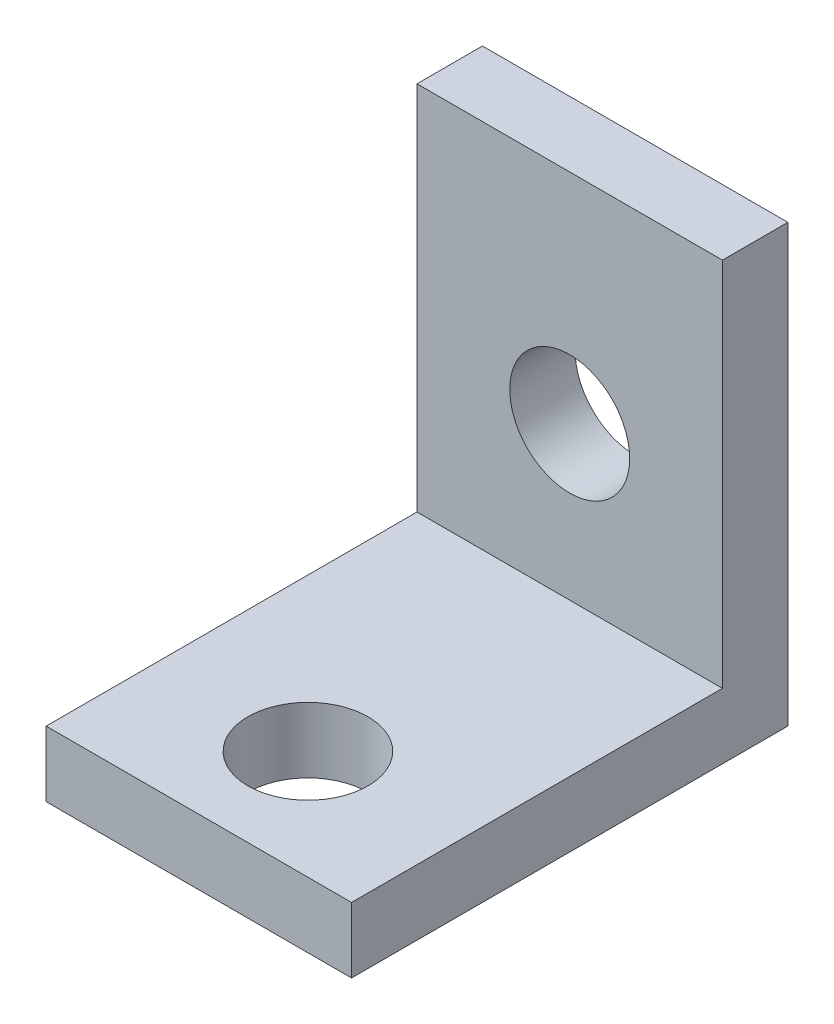
ISO-10303-21;
HEADER;
FILE_DESCRIPTION(('STEP AP214'),'2;1');
FILE_NAME('part.step','',(''),(''),'','','');
FILE_SCHEMA(('AUTOMOTIVE_DESIGN { 1 0 10303 214 1 1 1 1 }'));
ENDSEC;
DATA;
#1=APPLICATION_CONTEXT('core data for automotive mechanical design processes');
#2=APPLICATION_PROTOCOL_DEFINITION('international standard','automotive_design',2000,#1);
#3=PRODUCT_CONTEXT('',#1,'mechanical');
#4=PRODUCT('Part','Part','',(#3));
#5=PRODUCT_RELATED_PRODUCT_CATEGORY('part','',(#4));
#6=PRODUCT_DEFINITION_FORMATION('','',#4);
#7=PRODUCT_DEFINITION_CONTEXT('part definition',#1,'design');
#8=PRODUCT_DEFINITION('design','',#6,#7);
#9=PRODUCT_DEFINITION_SHAPE('','',#8);
#10=(LENGTH_UNIT() NAMED_UNIT(*) SI_UNIT(.MILLI.,.METRE.));
#11=(NAMED_UNIT(*) PLANE_ANGLE_UNIT() SI_UNIT($,.RADIAN.));
#12=(NAMED_UNIT(*) SI_UNIT($,.STERADIAN.) SOLID_ANGLE_UNIT());
#13=UNCERTAINTY_MEASURE_WITH_UNIT(LENGTH_MEASURE(1.E-05),#10,'distance_accuracy_value','');
#14=(GEOMETRIC_REPRESENTATION_CONTEXT(3) GLOBAL_UNCERTAINTY_ASSIGNED_CONTEXT((#13)) GLOBAL_UNIT_ASSIGNED_CONTEXT((#10,
#11,#12)) REPRESENTATION_CONTEXT('',''));
#15=CARTESIAN_POINT('',(0.,0.,0.));
#16=DIRECTION('',(0.,0.,1.));
#17=DIRECTION('',(1.,0.,0.));
#18=AXIS2_PLACEMENT_3D('',#15,#16,#17);
#19=CARTESIAN_POINT('',(7.,0.,20.));
#20=DIRECTION('',(0.,1.,0.));
#21=DIRECTION('',(0.,0.,1.));
#22=AXIS2_PLACEMENT_3D('',#19,#20,#21);
#23=PLANE('',#22);
#24=DIRECTION('',(-1.,0.,0.));
#25=VECTOR('',#24,1.);
#26=CARTESIAN_POINT('',(7.,0.,20.));
#27=LINE('',#26,#25);
#28=CARTESIAN_POINT('',(7.,0.,20.));
#29=VERTEX_POINT('',#28);
#30=CARTESIAN_POINT('',(-7.,0.,20.));
#31=VERTEX_POINT('',#30);
#32=EDGE_CURVE('E11',#29,#31,#27,.T.);
#33=ORIENTED_EDGE('',*,*,#32,.T.);
#34=DIRECTION('',(0.,0.,-1.));
#35=VECTOR('',#34,1.);
#36=CARTESIAN_POINT('',(-7.,0.,20.));
#37=LINE('',#36,#35);
#38=CARTESIAN_POINT('',(-7.,0.,0.));
#39=VERTEX_POINT('',#38);
#40=EDGE_CURVE('E88',#31,#39,#37,.T.);
#41=ORIENTED_EDGE('',*,*,#40,.T.);
#42=DIRECTION('',(-1.,0.,0.));
#43=VECTOR('',#42,1.);
#44=CARTESIAN_POINT('',(7.,0.,0.));
#45=LINE('',#44,#43);
#46=CARTESIAN_POINT('',(7.,0.,0.));
#47=VERTEX_POINT('',#46);
#48=EDGE_CURVE('E41',#47,#39,#45,.T.);
#49=ORIENTED_EDGE('',*,*,#48,.F.);
#50=DIRECTION('',(0.,0.,-1.));
#51=VECTOR('',#50,1.);
#52=CARTESIAN_POINT('',(7.,0.,20.));
#53=LINE('',#52,#51);
#54=EDGE_CURVE('E89',#29,#47,#53,.T.);
#55=ORIENTED_EDGE('',*,*,#54,.F.);
#56=EDGE_LOOP('',(#33,#41,#49,#55));
#57=FACE_BOUND('',#56,.T.);
#58=CARTESIAN_POINT('',(0.,0.,15.));
#59=DIRECTION('',(0.,1.,0.));
#60=DIRECTION('',(0.,0.,1.));
#61=AXIS2_PLACEMENT_3D('',#58,#59,#60);
#62=CIRCLE('',#61,2.75);
#63=CARTESIAN_POINT('',(0.,0.,17.75));
#64=VERTEX_POINT('',#63);
#65=EDGE_CURVE('E159',#64,#64,#62,.T.);
#66=ORIENTED_EDGE('',*,*,#65,.T.);
#67=EDGE_LOOP('',(#66));
#68=FACE_BOUND('',#67,.T.);
#69=ADVANCED_FACE('F33',(#57,#68),#23,.F.);
#70=CARTESIAN_POINT('',(7.,3.,3.));
#71=DIRECTION('',(0.,-1.,0.));
#72=DIRECTION('',(0.,0.,-1.));
#73=AXIS2_PLACEMENT_3D('',#70,#71,#72);
#74=PLANE('',#73);
#75=DIRECTION('',(-1.,0.,0.));
#76=VECTOR('',#75,1.);
#77=CARTESIAN_POINT('',(7.,3.,3.));
#78=LINE('',#77,#76);
#79=CARTESIAN_POINT('',(7.,3.,3.));
#80=VERTEX_POINT('',#79);
#81=CARTESIAN_POINT('',(-7.,3.,3.));
#82=VERTEX_POINT('',#81);
#83=EDGE_CURVE('E131',#80,#82,#78,.T.);
#84=ORIENTED_EDGE('',*,*,#83,.T.);
#85=DIRECTION('',(0.,0.,1.));
#86=VECTOR('',#85,1.);
#87=CARTESIAN_POINT('',(-7.,3.,3.));
#88=LINE('',#87,#86);
#89=CARTESIAN_POINT('',(-7.,3.,20.));
#90=VERTEX_POINT('',#89);
#91=EDGE_CURVE('E119',#82,#90,#88,.T.);
#92=ORIENTED_EDGE('',*,*,#91,.T.);
#93=DIRECTION('',(-1.,0.,0.));
#94=VECTOR('',#93,1.);
#95=CARTESIAN_POINT('',(7.,3.,20.));
#96=LINE('',#95,#94);
#97=CARTESIAN_POINT('',(7.,3.,20.));
#98=VERTEX_POINT('',#97);
#99=EDGE_CURVE('E104',#98,#90,#96,.T.);
#100=ORIENTED_EDGE('',*,*,#99,.F.);
#101=DIRECTION('',(0.,0.,1.));
#102=VECTOR('',#101,1.);
#103=CARTESIAN_POINT('',(7.,3.,3.));
#104=LINE('',#103,#102);
#105=EDGE_CURVE('E48',#80,#98,#104,.T.);
#106=ORIENTED_EDGE('',*,*,#105,.F.);
#107=EDGE_LOOP('',(#84,#92,#100,#106));
#108=FACE_BOUND('',#107,.T.);
#109=CARTESIAN_POINT('',(0.,3.,15.));
#110=DIRECTION('',(0.,1.,0.));
#111=DIRECTION('',(0.,0.,1.));
#112=AXIS2_PLACEMENT_3D('',#109,#110,#111);
#113=CIRCLE('',#112,2.75);
#114=CARTESIAN_POINT('',(0.,3.,17.75));
#115=VERTEX_POINT('',#114);
#116=EDGE_CURVE('E157',#115,#115,#113,.T.);
#117=ORIENTED_EDGE('',*,*,#116,.F.);
#118=EDGE_LOOP('',(#117));
#119=FACE_BOUND('',#118,.T.);
#120=ADVANCED_FACE('F151',(#108,#119),#74,.F.);
#121=CARTESIAN_POINT('',(7.,0.,0.));
#122=DIRECTION('',(0.,0.,1.));
#123=DIRECTION('',(1.,0.,0.));
#124=AXIS2_PLACEMENT_3D('',#121,#122,#123);
#125=PLANE('',#124);
#126=ORIENTED_EDGE('',*,*,#48,.T.);
#127=DIRECTION('',(0.,1.,0.));
#128=VECTOR('',#127,1.);
#129=CARTESIAN_POINT('',(-7.,0.,0.));
#130=LINE('',#129,#128);
#131=CARTESIAN_POINT('',(-7.,20.,0.));
#132=VERTEX_POINT('',#131);
#133=EDGE_CURVE('E102',#39,#132,#130,.T.);
#134=ORIENTED_EDGE('',*,*,#133,.T.);
#135=DIRECTION('',(-1.,0.,0.));
#136=VECTOR('',#135,1.);
#137=CARTESIAN_POINT('',(7.,20.,0.));
#138=LINE('',#137,#136);
#139=CARTESIAN_POINT('',(7.,20.,0.));
#140=VERTEX_POINT('',#139);
#141=EDGE_CURVE('E135',#140,#132,#138,.T.);
#142=ORIENTED_EDGE('',*,*,#141,.F.);
#143=DIRECTION('',(0.,1.,0.));
#144=VECTOR('',#143,1.);
#145=CARTESIAN_POINT('',(7.,0.,0.));
#146=LINE('',#145,#144);
#147=EDGE_CURVE('E124',#47,#140,#146,.T.);
#148=ORIENTED_EDGE('',*,*,#147,.F.);
#149=EDGE_LOOP('',(#126,#134,#142,#148));
#150=FACE_BOUND('',#149,.T.);
#151=CARTESIAN_POINT('',(0.,10.,0.));
#152=DIRECTION('',(0.,0.,1.));
#153=DIRECTION('',(1.,0.,0.));
#154=AXIS2_PLACEMENT_3D('',#151,#152,#153);
#155=CIRCLE('',#154,2.75);
#156=CARTESIAN_POINT('',(2.75,10.,0.));
#157=VERTEX_POINT('',#156);
#158=EDGE_CURVE('E108',#157,#157,#155,.T.);
#159=ORIENTED_EDGE('',*,*,#158,.T.);
#160=EDGE_LOOP('',(#159));
#161=FACE_BOUND('',#160,.T.);
#162=ADVANCED_FACE('F138',(#150,#161),#125,.F.);
#163=CARTESIAN_POINT('',(7.,20.,3.));
#164=DIRECTION('',(0.,0.,-1.));
#165=DIRECTION('',(-1.,0.,0.));
#166=AXIS2_PLACEMENT_3D('',#163,#164,#165);
#167=PLANE('',#166);
#168=DIRECTION('',(-1.,0.,0.));
#169=VECTOR('',#168,1.);
#170=CARTESIAN_POINT('',(7.,20.,3.));
#171=LINE('',#170,#169);
#172=CARTESIAN_POINT('',(7.,20.,3.));
#173=VERTEX_POINT('',#172);
#174=CARTESIAN_POINT('',(-7.,20.,3.));
#175=VERTEX_POINT('',#174);
#176=EDGE_CURVE('E133',#173,#175,#171,.T.);
#177=ORIENTED_EDGE('',*,*,#176,.T.);
#178=DIRECTION('',(0.,-1.,0.));
#179=VECTOR('',#178,1.);
#180=CARTESIAN_POINT('',(-7.,20.,3.));
#181=LINE('',#180,#179);
#182=EDGE_CURVE('E116',#175,#82,#181,.T.);
#183=ORIENTED_EDGE('',*,*,#182,.T.);
#184=ORIENTED_EDGE('',*,*,#83,.F.);
#185=DIRECTION('',(0.,-1.,0.));
#186=VECTOR('',#185,1.);
#187=CARTESIAN_POINT('',(7.,20.,3.));
#188=LINE('',#187,#186);
#189=EDGE_CURVE('E53',#173,#80,#188,.T.);
#190=ORIENTED_EDGE('',*,*,#189,.F.);
#191=EDGE_LOOP('',(#177,#183,#184,#190));
#192=FACE_BOUND('',#191,.T.);
#193=CARTESIAN_POINT('',(0.,10.,3.));
#194=DIRECTION('',(0.,0.,1.));
#195=DIRECTION('',(1.,0.,0.));
#196=AXIS2_PLACEMENT_3D('',#193,#194,#195);
#197=CIRCLE('',#196,2.75);
#198=CARTESIAN_POINT('',(2.75,10.,3.));
#199=VERTEX_POINT('',#198);
#200=EDGE_CURVE('E105',#199,#199,#197,.T.);
#201=ORIENTED_EDGE('',*,*,#200,.F.);
#202=EDGE_LOOP('',(#201));
#203=FACE_BOUND('',#202,.T.);
#204=ADVANCED_FACE('F148',(#192,#203),#167,.F.);
#205=CARTESIAN_POINT('',(7.,3.,20.));
#206=DIRECTION('',(0.,0.,-1.));
#207=DIRECTION('',(-1.,0.,0.));
#208=AXIS2_PLACEMENT_3D('',#205,#206,#207);
#209=PLANE('',#208);
#210=ORIENTED_EDGE('',*,*,#99,.T.);
#211=DIRECTION('',(0.,-1.,0.));
#212=VECTOR('',#211,1.);
#213=CARTESIAN_POINT('',(-7.,3.,20.));
#214=LINE('',#213,#212);
#215=EDGE_CURVE('E98',#90,#31,#214,.T.);
#216=ORIENTED_EDGE('',*,*,#215,.T.);
#217=ORIENTED_EDGE('',*,*,#32,.F.);
#218=DIRECTION('',(0.,-1.,0.));
#219=VECTOR('',#218,1.);
#220=CARTESIAN_POINT('',(7.,3.,20.));
#221=LINE('',#220,#219);
#222=EDGE_CURVE('E121',#98,#29,#221,.T.);
#223=ORIENTED_EDGE('',*,*,#222,.F.);
#224=EDGE_LOOP('',(#210,#216,#217,#223));
#225=FACE_BOUND('',#224,.T.);
#226=ADVANCED_FACE('F35',(#225),#209,.F.);
#227=CARTESIAN_POINT('',(7.,20.,0.));
#228=DIRECTION('',(0.,-1.,0.));
#229=DIRECTION('',(0.,0.,-1.));
#230=AXIS2_PLACEMENT_3D('',#227,#228,#229);
#231=PLANE('',#230);
#232=ORIENTED_EDGE('',*,*,#141,.T.);
#233=DIRECTION('',(0.,0.,1.));
#234=VECTOR('',#233,1.);
#235=CARTESIAN_POINT('',(-7.,20.,0.));
#236=LINE('',#235,#234);
#237=EDGE_CURVE('E113',#132,#175,#236,.T.);
#238=ORIENTED_EDGE('',*,*,#237,.T.);
#239=ORIENTED_EDGE('',*,*,#176,.F.);
#240=DIRECTION('',(0.,0.,1.));
#241=VECTOR('',#240,1.);
#242=CARTESIAN_POINT('',(7.,20.,0.));
#243=LINE('',#242,#241);
#244=EDGE_CURVE('E126',#140,#173,#243,.T.);
#245=ORIENTED_EDGE('',*,*,#244,.F.);
#246=EDGE_LOOP('',(#232,#238,#239,#245));
#247=FACE_BOUND('',#246,.T.);
#248=ADVANCED_FACE('F145',(#247),#231,.F.);
#249=CARTESIAN_POINT('',(7.,0.,0.));
#250=DIRECTION('',(1.,0.,0.));
#251=DIRECTION('',(0.,0.,-1.));
#252=AXIS2_PLACEMENT_3D('',#249,#250,#251);
#253=PLANE('',#252);
#254=ORIENTED_EDGE('',*,*,#222,.T.);
#255=ORIENTED_EDGE('',*,*,#54,.T.);
#256=ORIENTED_EDGE('',*,*,#147,.T.);
#257=ORIENTED_EDGE('',*,*,#244,.T.);
#258=ORIENTED_EDGE('',*,*,#189,.T.);
#259=ORIENTED_EDGE('',*,*,#105,.T.);
#260=EDGE_LOOP('',(#254,#255,#256,#257,#258,#259));
#261=FACE_BOUND('',#260,.T.);
#262=ADVANCED_FACE('F142',(#261),#253,.T.);
#263=CARTESIAN_POINT('',(-7.,0.,0.));
#264=DIRECTION('',(1.,0.,0.));
#265=DIRECTION('',(0.,0.,-1.));
#266=AXIS2_PLACEMENT_3D('',#263,#264,#265);
#267=PLANE('',#266);
#268=ORIENTED_EDGE('',*,*,#215,.F.);
#269=ORIENTED_EDGE('',*,*,#91,.F.);
#270=ORIENTED_EDGE('',*,*,#182,.F.);
#271=ORIENTED_EDGE('',*,*,#237,.F.);
#272=ORIENTED_EDGE('',*,*,#133,.F.);
#273=ORIENTED_EDGE('',*,*,#40,.F.);
#274=EDGE_LOOP('',(#268,#269,#270,#271,#272,#273));
#275=FACE_BOUND('',#274,.T.);
#276=ADVANCED_FACE('F96',(#275),#267,.F.);
#277=CARTESIAN_POINT('',(0.,10.,3.));
#278=DIRECTION('',(0.,0.,-1.));
#279=DIRECTION('',(-1.,0.,0.));
#280=AXIS2_PLACEMENT_3D('',#277,#278,#279);
#281=CYLINDRICAL_SURFACE('',#280,2.75);
#282=ORIENTED_EDGE('',*,*,#200,.T.);
#283=EDGE_LOOP('',(#282));
#284=FACE_BOUND('',#283,.T.);
#285=ORIENTED_EDGE('',*,*,#158,.F.);
#286=EDGE_LOOP('',(#285));
#287=FACE_BOUND('',#286,.T.);
#288=ADVANCED_FACE('F168',(#284,#287),#281,.F.);
#289=CARTESIAN_POINT('',(0.,3.,15.));
#290=DIRECTION('',(0.,-1.,0.));
#291=DIRECTION('',(0.,0.,-1.));
#292=AXIS2_PLACEMENT_3D('',#289,#290,#291);
#293=CYLINDRICAL_SURFACE('',#292,2.75);
#294=ORIENTED_EDGE('',*,*,#116,.T.);
#295=EDGE_LOOP('',(#294));
#296=FACE_BOUND('',#295,.T.);
#297=ORIENTED_EDGE('',*,*,#65,.F.);
#298=EDGE_LOOP('',(#297));
#299=FACE_BOUND('',#298,.T.);
#300=ADVANCED_FACE('F166',(#296,#299),#293,.F.);
#301=CLOSED_SHELL('',(#69,#120,#162,#204,#226,#248,#262,#276,#288,#300));
#302=MANIFOLD_SOLID_BREP('B2',#301);
#303=ADVANCED_BREP_SHAPE_REPRESENTATION('',(#18,#302),#14);
#304=SHAPE_DEFINITION_REPRESENTATION(#9,#303);
ENDSEC;
END-ISO-10303-21;
